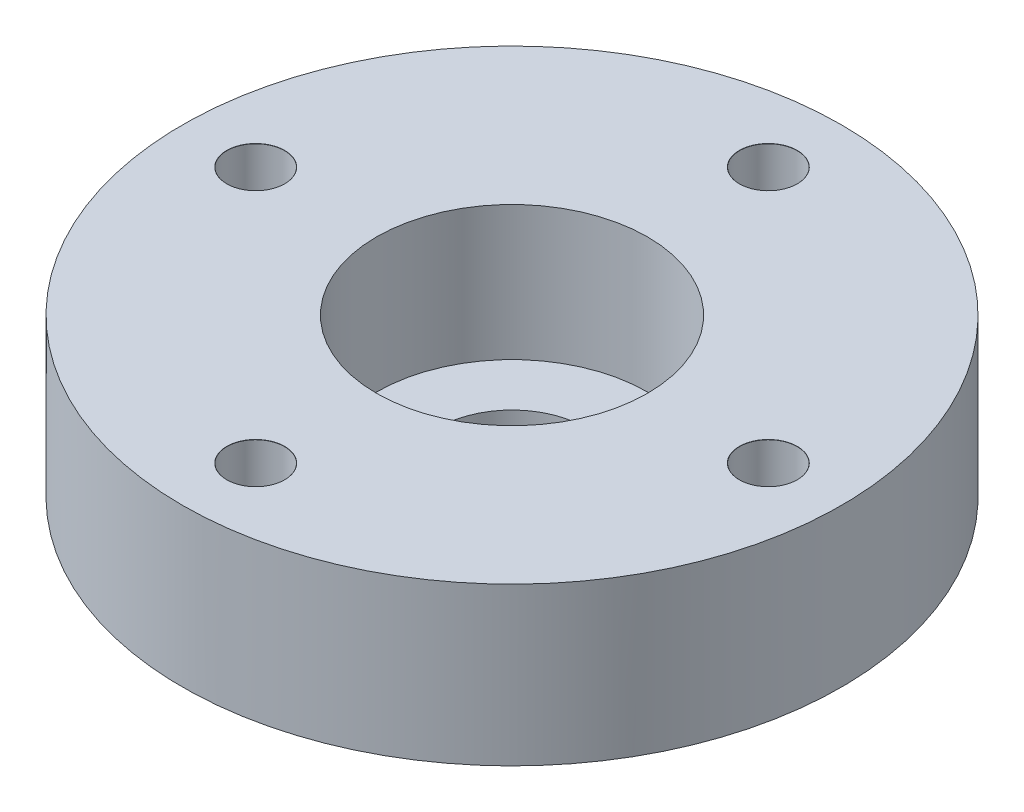
ISO-10303-21;
HEADER;
FILE_DESCRIPTION(('STEP AP214'),'2;1');
FILE_NAME('part.step','',(''),(''),'','','');
FILE_SCHEMA(('AUTOMOTIVE_DESIGN { 1 0 10303 214 1 1 1 1 }'));
ENDSEC;
DATA;
#1=APPLICATION_CONTEXT('core data for automotive mechanical design processes');
#2=APPLICATION_PROTOCOL_DEFINITION('international standard','automotive_design',2000,#1);
#3=PRODUCT_CONTEXT('',#1,'mechanical');
#4=PRODUCT('Part','Part','',(#3));
#5=PRODUCT_RELATED_PRODUCT_CATEGORY('part','',(#4));
#6=PRODUCT_DEFINITION_FORMATION('','',#4);
#7=PRODUCT_DEFINITION_CONTEXT('part definition',#1,'design');
#8=PRODUCT_DEFINITION('design','',#6,#7);
#9=PRODUCT_DEFINITION_SHAPE('','',#8);
#10=(LENGTH_UNIT() NAMED_UNIT(*) SI_UNIT(.MILLI.,.METRE.));
#11=(NAMED_UNIT(*) PLANE_ANGLE_UNIT() SI_UNIT($,.RADIAN.));
#12=(NAMED_UNIT(*) SI_UNIT($,.STERADIAN.) SOLID_ANGLE_UNIT());
#13=UNCERTAINTY_MEASURE_WITH_UNIT(LENGTH_MEASURE(1.E-05),#10,'distance_accuracy_value','');
#14=(GEOMETRIC_REPRESENTATION_CONTEXT(3) GLOBAL_UNCERTAINTY_ASSIGNED_CONTEXT((#13)) GLOBAL_UNIT_ASSIGNED_CONTEXT((#10,
#11,#12)) REPRESENTATION_CONTEXT('',''));
#15=CARTESIAN_POINT('',(0.,0.,0.));
#16=DIRECTION('',(0.,0.,1.));
#17=DIRECTION('',(1.,0.,0.));
#18=AXIS2_PLACEMENT_3D('',#15,#16,#17);
#19=CARTESIAN_POINT('',(0.,-7.,0.));
#20=DIRECTION('',(0.,-1.,0.));
#21=DIRECTION('',(0.,0.,-1.));
#22=AXIS2_PLACEMENT_3D('',#19,#20,#21);
#23=PLANE('',#22);
#24=CARTESIAN_POINT('',(-44.45,-7.,0.));
#25=DIRECTION('',(0.,1.,0.));
#26=DIRECTION('',(0.,0.,1.));
#27=AXIS2_PLACEMENT_3D('',#24,#25,#26);
#28=CIRCLE('',#27,5.025);
#29=CARTESIAN_POINT('',(-44.45,-7.,5.025));
#30=VERTEX_POINT('',#29);
#31=EDGE_CURVE('E112',#30,#30,#28,.T.);
#32=ORIENTED_EDGE('',*,*,#31,.T.);
#33=EDGE_LOOP('',(#32));
#34=FACE_BOUND('',#33,.T.);
#35=CARTESIAN_POINT('',(0.,-7.,44.45));
#36=DIRECTION('',(0.,1.,0.));
#37=DIRECTION('',(0.,0.,1.));
#38=AXIS2_PLACEMENT_3D('',#35,#36,#37);
#39=CIRCLE('',#38,5.02499999999999);
#40=CARTESIAN_POINT('',(0.,-7.,49.475));
#41=VERTEX_POINT('',#40);
#42=EDGE_CURVE('E100',#41,#41,#39,.T.);
#43=ORIENTED_EDGE('',*,*,#42,.T.);
#44=EDGE_LOOP('',(#43));
#45=FACE_BOUND('',#44,.T.);
#46=CARTESIAN_POINT('',(0.,-7.,-44.45));
#47=DIRECTION('',(0.,1.,0.));
#48=DIRECTION('',(0.,0.,1.));
#49=AXIS2_PLACEMENT_3D('',#46,#47,#48);
#50=CIRCLE('',#49,5.02499999999999);
#51=CARTESIAN_POINT('',(0.,-7.,-39.425));
#52=VERTEX_POINT('',#51);
#53=EDGE_CURVE('E88',#52,#52,#50,.T.);
#54=ORIENTED_EDGE('',*,*,#53,.T.);
#55=EDGE_LOOP('',(#54));
#56=FACE_BOUND('',#55,.T.);
#57=CARTESIAN_POINT('',(44.45,-7.,0.));
#58=DIRECTION('',(0.,1.,0.));
#59=DIRECTION('',(0.,0.,1.));
#60=AXIS2_PLACEMENT_3D('',#57,#58,#59);
#61=CIRCLE('',#60,5.025);
#62=CARTESIAN_POINT('',(44.45,-7.,5.025));
#63=VERTEX_POINT('',#62);
#64=EDGE_CURVE('E76',#63,#63,#61,.T.);
#65=ORIENTED_EDGE('',*,*,#64,.T.);
#66=EDGE_LOOP('',(#65));
#67=FACE_BOUND('',#66,.T.);
#68=CARTESIAN_POINT('',(0.,-7.,0.));
#69=DIRECTION('',(0.,-1.,0.));
#70=DIRECTION('',(0.,0.,-1.));
#71=AXIS2_PLACEMENT_3D('',#68,#69,#70);
#72=CIRCLE('',#71,57.15);
#73=CARTESIAN_POINT('',(0.,-7.,-57.15));
#74=VERTEX_POINT('',#73);
#75=EDGE_CURVE('E42',#74,#74,#72,.T.);
#76=ORIENTED_EDGE('',*,*,#75,.T.);
#77=EDGE_LOOP('',(#76));
#78=FACE_BOUND('',#77,.T.);
#79=CARTESIAN_POINT('',(0.,-7.,0.));
#80=DIRECTION('',(0.,-1.,0.));
#81=DIRECTION('',(0.,0.,-1.));
#82=AXIS2_PLACEMENT_3D('',#79,#80,#81);
#83=CIRCLE('',#82,15.);
#84=CARTESIAN_POINT('',(0.,-7.,-15.));
#85=VERTEX_POINT('',#84);
#86=EDGE_CURVE('E53',#85,#85,#83,.T.);
#87=ORIENTED_EDGE('',*,*,#86,.F.);
#88=EDGE_LOOP('',(#87));
#89=FACE_BOUND('',#88,.T.);
#90=ADVANCED_FACE('F35',(#34,#45,#56,#67,#78,#89),#23,.T.);
#91=CARTESIAN_POINT('',(0.,175.644610179245,0.));
#92=DIRECTION('',(0.,-1.,0.));
#93=DIRECTION('',(0.,0.,-1.));
#94=AXIS2_PLACEMENT_3D('',#91,#92,#93);
#95=CYLINDRICAL_SURFACE('',#94,57.15);
#96=ORIENTED_EDGE('',*,*,#75,.F.);
#97=EDGE_LOOP('',(#96));
#98=FACE_BOUND('',#97,.T.);
#99=CARTESIAN_POINT('',(0.,20.3,0.));
#100=DIRECTION('',(0.,1.,0.));
#101=DIRECTION('',(0.,0.,1.));
#102=AXIS2_PLACEMENT_3D('',#99,#100,#101);
#103=CIRCLE('',#102,57.15);
#104=CARTESIAN_POINT('',(0.,20.3,57.15));
#105=VERTEX_POINT('',#104);
#106=EDGE_CURVE('E61',#105,#105,#103,.T.);
#107=ORIENTED_EDGE('',*,*,#106,.F.);
#108=EDGE_LOOP('',(#107));
#109=FACE_BOUND('',#108,.T.);
#110=ADVANCED_FACE('F37',(#98,#109),#95,.T.);
#111=CARTESIAN_POINT('',(0.,80.4680374315355,0.));
#112=DIRECTION('',(0.,-1.,0.));
#113=DIRECTION('',(0.,0.,-1.));
#114=AXIS2_PLACEMENT_3D('',#111,#112,#113);
#115=CYLINDRICAL_SURFACE('',#114,23.5);
#116=CARTESIAN_POINT('',(0.,-3.,0.));
#117=DIRECTION('',(0.,-1.,0.));
#118=DIRECTION('',(0.,0.,-1.));
#119=AXIS2_PLACEMENT_3D('',#116,#117,#118);
#120=CIRCLE('',#119,23.5);
#121=CARTESIAN_POINT('',(0.,-3.,-23.5));
#122=VERTEX_POINT('',#121);
#123=EDGE_CURVE('E10',#122,#122,#120,.F.);
#124=ORIENTED_EDGE('',*,*,#123,.F.);
#125=EDGE_LOOP('',(#124));
#126=FACE_BOUND('',#125,.T.);
#127=CARTESIAN_POINT('',(0.,20.3,0.));
#128=DIRECTION('',(0.,1.,0.));
#129=DIRECTION('',(0.,0.,1.));
#130=AXIS2_PLACEMENT_3D('',#127,#128,#129);
#131=CIRCLE('',#130,23.5);
#132=CARTESIAN_POINT('',(0.,20.3,23.5));
#133=VERTEX_POINT('',#132);
#134=EDGE_CURVE('E64',#133,#133,#131,.T.);
#135=ORIENTED_EDGE('',*,*,#134,.T.);
#136=EDGE_LOOP('',(#135));
#137=FACE_BOUND('',#136,.T.);
#138=ADVANCED_FACE('F153',(#126,#137),#115,.F.);
#139=CARTESIAN_POINT('',(0.,-3.,0.));
#140=DIRECTION('',(0.,-1.,0.));
#141=DIRECTION('',(0.,0.,-1.));
#142=AXIS2_PLACEMENT_3D('',#139,#140,#141);
#143=PLANE('',#142);
#144=CARTESIAN_POINT('',(0.,-3.,0.));
#145=DIRECTION('',(0.,-1.,0.));
#146=DIRECTION('',(0.,0.,-1.));
#147=AXIS2_PLACEMENT_3D('',#144,#145,#146);
#148=CIRCLE('',#147,12.8);
#149=CARTESIAN_POINT('',(0.,-3.,-12.8));
#150=VERTEX_POINT('',#149);
#151=EDGE_CURVE('E46',#150,#150,#148,.T.);
#152=ORIENTED_EDGE('',*,*,#151,.T.);
#153=EDGE_LOOP('',(#152));
#154=FACE_BOUND('',#153,.T.);
#155=ORIENTED_EDGE('',*,*,#123,.T.);
#156=EDGE_LOOP('',(#155));
#157=FACE_BOUND('',#156,.T.);
#158=ADVANCED_FACE('F155',(#154,#157),#143,.F.);
#159=CARTESIAN_POINT('',(0.,-7.,0.));
#160=DIRECTION('',(0.,1.,0.));
#161=DIRECTION('',(0.,0.,1.));
#162=AXIS2_PLACEMENT_3D('',#159,#160,#161);
#163=CYLINDRICAL_SURFACE('',#162,12.8);
#164=ORIENTED_EDGE('',*,*,#151,.F.);
#165=EDGE_LOOP('',(#164));
#166=FACE_BOUND('',#165,.T.);
#167=CARTESIAN_POINT('',(0.,-9.,0.));
#168=DIRECTION('',(0.,-1.,0.));
#169=DIRECTION('',(0.,0.,-1.));
#170=AXIS2_PLACEMENT_3D('',#167,#168,#169);
#171=CIRCLE('',#170,12.8);
#172=CARTESIAN_POINT('',(0.,-9.,-12.8));
#173=VERTEX_POINT('',#172);
#174=EDGE_CURVE('E56',#173,#173,#171,.T.);
#175=ORIENTED_EDGE('',*,*,#174,.T.);
#176=EDGE_LOOP('',(#175));
#177=FACE_BOUND('',#176,.T.);
#178=ADVANCED_FACE('F161',(#166,#177),#163,.F.);
#179=CARTESIAN_POINT('',(0.,-9.,0.));
#180=DIRECTION('',(0.,-1.,0.));
#181=DIRECTION('',(0.,0.,-1.));
#182=AXIS2_PLACEMENT_3D('',#179,#180,#181);
#183=PLANE('',#182);
#184=CARTESIAN_POINT('',(0.,-9.,0.));
#185=DIRECTION('',(0.,-1.,0.));
#186=DIRECTION('',(0.,0.,-1.));
#187=AXIS2_PLACEMENT_3D('',#184,#185,#186);
#188=CIRCLE('',#187,15.);
#189=CARTESIAN_POINT('',(0.,-9.,-15.));
#190=VERTEX_POINT('',#189);
#191=EDGE_CURVE('E50',#190,#190,#188,.T.);
#192=ORIENTED_EDGE('',*,*,#191,.T.);
#193=EDGE_LOOP('',(#192));
#194=FACE_BOUND('',#193,.T.);
#195=ORIENTED_EDGE('',*,*,#174,.F.);
#196=EDGE_LOOP('',(#195));
#197=FACE_BOUND('',#196,.T.);
#198=ADVANCED_FACE('F172',(#194,#197),#183,.T.);
#199=CARTESIAN_POINT('',(0.,-9.,0.));
#200=DIRECTION('',(0.,1.,0.));
#201=DIRECTION('',(0.,0.,1.));
#202=AXIS2_PLACEMENT_3D('',#199,#200,#201);
#203=CYLINDRICAL_SURFACE('',#202,15.);
#204=ORIENTED_EDGE('',*,*,#191,.F.);
#205=EDGE_LOOP('',(#204));
#206=FACE_BOUND('',#205,.T.);
#207=ORIENTED_EDGE('',*,*,#86,.T.);
#208=EDGE_LOOP('',(#207));
#209=FACE_BOUND('',#208,.T.);
#210=ADVANCED_FACE('F141',(#206,#209),#203,.T.);
#211=CARTESIAN_POINT('',(0.,20.3,0.));
#212=DIRECTION('',(0.,1.,0.));
#213=DIRECTION('',(0.,0.,1.));
#214=AXIS2_PLACEMENT_3D('',#211,#212,#213);
#215=PLANE('',#214);
#216=CARTESIAN_POINT('',(-44.45,20.3,0.));
#217=DIRECTION('',(0.,1.,0.));
#218=DIRECTION('',(0.,0.,1.));
#219=AXIS2_PLACEMENT_3D('',#216,#217,#218);
#220=CIRCLE('',#219,5.025);
#221=CARTESIAN_POINT('',(-44.45,20.3,5.025));
#222=VERTEX_POINT('',#221);
#223=EDGE_CURVE('E109',#222,#222,#220,.T.);
#224=ORIENTED_EDGE('',*,*,#223,.F.);
#225=EDGE_LOOP('',(#224));
#226=FACE_BOUND('',#225,.T.);
#227=CARTESIAN_POINT('',(0.,20.3,44.45));
#228=DIRECTION('',(0.,1.,0.));
#229=DIRECTION('',(0.,0.,1.));
#230=AXIS2_PLACEMENT_3D('',#227,#228,#229);
#231=CIRCLE('',#230,5.025);
#232=CARTESIAN_POINT('',(0.,20.3,49.475));
#233=VERTEX_POINT('',#232);
#234=EDGE_CURVE('E97',#233,#233,#231,.T.);
#235=ORIENTED_EDGE('',*,*,#234,.F.);
#236=EDGE_LOOP('',(#235));
#237=FACE_BOUND('',#236,.T.);
#238=CARTESIAN_POINT('',(0.,20.3,-44.45));
#239=DIRECTION('',(0.,1.,0.));
#240=DIRECTION('',(0.,0.,1.));
#241=AXIS2_PLACEMENT_3D('',#238,#239,#240);
#242=CIRCLE('',#241,5.025);
#243=CARTESIAN_POINT('',(0.,20.3,-39.425));
#244=VERTEX_POINT('',#243);
#245=EDGE_CURVE('E85',#244,#244,#242,.T.);
#246=ORIENTED_EDGE('',*,*,#245,.F.);
#247=EDGE_LOOP('',(#246));
#248=FACE_BOUND('',#247,.T.);
#249=CARTESIAN_POINT('',(44.45,20.3,0.));
#250=DIRECTION('',(0.,1.,0.));
#251=DIRECTION('',(0.,0.,1.));
#252=AXIS2_PLACEMENT_3D('',#249,#250,#251);
#253=CIRCLE('',#252,5.025);
#254=CARTESIAN_POINT('',(44.45,20.3,5.025));
#255=VERTEX_POINT('',#254);
#256=EDGE_CURVE('E73',#255,#255,#253,.T.);
#257=ORIENTED_EDGE('',*,*,#256,.F.);
#258=EDGE_LOOP('',(#257));
#259=FACE_BOUND('',#258,.T.);
#260=ORIENTED_EDGE('',*,*,#106,.T.);
#261=EDGE_LOOP('',(#260));
#262=FACE_BOUND('',#261,.T.);
#263=ORIENTED_EDGE('',*,*,#134,.F.);
#264=EDGE_LOOP('',(#263));
#265=FACE_BOUND('',#264,.T.);
#266=ADVANCED_FACE('F137',(#226,#237,#248,#259,#262,#265),#215,.T.);
#267=CARTESIAN_POINT('',(44.45,-6.97499999999999,0.));
#268=DIRECTION('',(0.,-1.,0.));
#269=DIRECTION('',(0.,0.,-1.));
#270=AXIS2_PLACEMENT_3D('',#267,#268,#269);
#271=CONICAL_SURFACE('',#270,5.,0.785398163397309);
#272=ORIENTED_EDGE('',*,*,#64,.F.);
#273=EDGE_LOOP('',(#272));
#274=FACE_BOUND('',#273,.T.);
#275=CARTESIAN_POINT('',(44.45,-6.97499999999999,0.));
#276=DIRECTION('',(0.,1.,0.));
#277=DIRECTION('',(0.,0.,1.));
#278=AXIS2_PLACEMENT_3D('',#275,#276,#277);
#279=CIRCLE('',#278,5.);
#280=CARTESIAN_POINT('',(44.45,-6.97499999999999,5.));
#281=VERTEX_POINT('',#280);
#282=EDGE_CURVE('E67',#281,#281,#279,.T.);
#283=ORIENTED_EDGE('',*,*,#282,.T.);
#284=EDGE_LOOP('',(#283));
#285=FACE_BOUND('',#284,.T.);
#286=ADVANCED_FACE('F140',(#274,#285),#271,.F.);
#287=CARTESIAN_POINT('',(44.45,20.3,0.));
#288=DIRECTION('',(0.,1.,0.));
#289=DIRECTION('',(0.,0.,1.));
#290=AXIS2_PLACEMENT_3D('',#287,#288,#289);
#291=CYLINDRICAL_SURFACE('',#290,5.);
#292=ORIENTED_EDGE('',*,*,#282,.F.);
#293=EDGE_LOOP('',(#292));
#294=FACE_BOUND('',#293,.T.);
#295=CARTESIAN_POINT('',(44.45,20.275,0.));
#296=DIRECTION('',(0.,1.,0.));
#297=DIRECTION('',(0.,0.,1.));
#298=AXIS2_PLACEMENT_3D('',#295,#296,#297);
#299=CIRCLE('',#298,5.);
#300=CARTESIAN_POINT('',(44.45,20.275,5.));
#301=VERTEX_POINT('',#300);
#302=EDGE_CURVE('E70',#301,#301,#299,.T.);
#303=ORIENTED_EDGE('',*,*,#302,.T.);
#304=EDGE_LOOP('',(#303));
#305=FACE_BOUND('',#304,.T.);
#306=ADVANCED_FACE('F182',(#294,#305),#291,.F.);
#307=CARTESIAN_POINT('',(44.45,20.3,0.));
#308=DIRECTION('',(0.,1.,0.));
#309=DIRECTION('',(0.,0.,1.));
#310=AXIS2_PLACEMENT_3D('',#307,#308,#309);
#311=CONICAL_SURFACE('',#310,5.025,0.785398163397379);
#312=ORIENTED_EDGE('',*,*,#302,.F.);
#313=EDGE_LOOP('',(#312));
#314=FACE_BOUND('',#313,.T.);
#315=ORIENTED_EDGE('',*,*,#256,.T.);
#316=EDGE_LOOP('',(#315));
#317=FACE_BOUND('',#316,.T.);
#318=ADVANCED_FACE('F186',(#314,#317),#311,.F.);
#319=CARTESIAN_POINT('',(0.,-6.97499999999999,-44.45));
#320=DIRECTION('',(0.,-1.,0.));
#321=DIRECTION('',(0.,0.,-1.));
#322=AXIS2_PLACEMENT_3D('',#319,#320,#321);
#323=CONICAL_SURFACE('',#322,4.99999999999999,0.785398163397344);
#324=ORIENTED_EDGE('',*,*,#53,.F.);
#325=EDGE_LOOP('',(#324));
#326=FACE_BOUND('',#325,.T.);
#327=CARTESIAN_POINT('',(0.,-6.97499999999999,-44.45));
#328=DIRECTION('',(0.,1.,0.));
#329=DIRECTION('',(0.,0.,1.));
#330=AXIS2_PLACEMENT_3D('',#327,#328,#329);
#331=CIRCLE('',#330,4.99999999999999);
#332=CARTESIAN_POINT('',(0.,-6.97499999999999,-39.45));
#333=VERTEX_POINT('',#332);
#334=EDGE_CURVE('E79',#333,#333,#331,.T.);
#335=ORIENTED_EDGE('',*,*,#334,.T.);
#336=EDGE_LOOP('',(#335));
#337=FACE_BOUND('',#336,.T.);
#338=ADVANCED_FACE('F190',(#326,#337),#323,.F.);
#339=CARTESIAN_POINT('',(0.,20.3,-44.45));
#340=DIRECTION('',(0.,1.,0.));
#341=DIRECTION('',(0.,0.,1.));
#342=AXIS2_PLACEMENT_3D('',#339,#340,#341);
#343=CYLINDRICAL_SURFACE('',#342,5.);
#344=ORIENTED_EDGE('',*,*,#334,.F.);
#345=EDGE_LOOP('',(#344));
#346=FACE_BOUND('',#345,.T.);
#347=CARTESIAN_POINT('',(0.,20.275,-44.45));
#348=DIRECTION('',(0.,1.,0.));
#349=DIRECTION('',(0.,0.,1.));
#350=AXIS2_PLACEMENT_3D('',#347,#348,#349);
#351=CIRCLE('',#350,5.);
#352=CARTESIAN_POINT('',(0.,20.275,-39.45));
#353=VERTEX_POINT('',#352);
#354=EDGE_CURVE('E82',#353,#353,#351,.T.);
#355=ORIENTED_EDGE('',*,*,#354,.T.);
#356=EDGE_LOOP('',(#355));
#357=FACE_BOUND('',#356,.T.);
#358=ADVANCED_FACE('F194',(#346,#357),#343,.F.);
#359=CARTESIAN_POINT('',(0.,20.3,-44.45));
#360=DIRECTION('',(0.,1.,0.));
#361=DIRECTION('',(0.,0.,1.));
#362=AXIS2_PLACEMENT_3D('',#359,#360,#361);
#363=CONICAL_SURFACE('',#362,5.025,0.785398163397362);
#364=ORIENTED_EDGE('',*,*,#354,.F.);
#365=EDGE_LOOP('',(#364));
#366=FACE_BOUND('',#365,.T.);
#367=ORIENTED_EDGE('',*,*,#245,.T.);
#368=EDGE_LOOP('',(#367));
#369=FACE_BOUND('',#368,.T.);
#370=ADVANCED_FACE('F198',(#366,#369),#363,.F.);
#371=CARTESIAN_POINT('',(0.,-6.97499999999999,44.45));
#372=DIRECTION('',(0.,-1.,0.));
#373=DIRECTION('',(0.,0.,-1.));
#374=AXIS2_PLACEMENT_3D('',#371,#372,#373);
#375=CONICAL_SURFACE('',#374,4.99999999999999,0.785398163397344);
#376=ORIENTED_EDGE('',*,*,#42,.F.);
#377=EDGE_LOOP('',(#376));
#378=FACE_BOUND('',#377,.T.);
#379=CARTESIAN_POINT('',(0.,-6.97499999999999,44.45));
#380=DIRECTION('',(0.,1.,0.));
#381=DIRECTION('',(0.,0.,1.));
#382=AXIS2_PLACEMENT_3D('',#379,#380,#381);
#383=CIRCLE('',#382,4.99999999999999);
#384=CARTESIAN_POINT('',(0.,-6.97499999999999,49.45));
#385=VERTEX_POINT('',#384);
#386=EDGE_CURVE('E91',#385,#385,#383,.T.);
#387=ORIENTED_EDGE('',*,*,#386,.T.);
#388=EDGE_LOOP('',(#387));
#389=FACE_BOUND('',#388,.T.);
#390=ADVANCED_FACE('F202',(#378,#389),#375,.F.);
#391=CARTESIAN_POINT('',(0.,20.3,44.45));
#392=DIRECTION('',(0.,1.,0.));
#393=DIRECTION('',(0.,0.,1.));
#394=AXIS2_PLACEMENT_3D('',#391,#392,#393);
#395=CYLINDRICAL_SURFACE('',#394,5.);
#396=ORIENTED_EDGE('',*,*,#386,.F.);
#397=EDGE_LOOP('',(#396));
#398=FACE_BOUND('',#397,.T.);
#399=CARTESIAN_POINT('',(0.,20.275,44.45));
#400=DIRECTION('',(0.,1.,0.));
#401=DIRECTION('',(0.,0.,1.));
#402=AXIS2_PLACEMENT_3D('',#399,#400,#401);
#403=CIRCLE('',#402,5.);
#404=CARTESIAN_POINT('',(0.,20.275,49.45));
#405=VERTEX_POINT('',#404);
#406=EDGE_CURVE('E94',#405,#405,#403,.T.);
#407=ORIENTED_EDGE('',*,*,#406,.T.);
#408=EDGE_LOOP('',(#407));
#409=FACE_BOUND('',#408,.T.);
#410=ADVANCED_FACE('F206',(#398,#409),#395,.F.);
#411=CARTESIAN_POINT('',(0.,20.3,44.45));
#412=DIRECTION('',(0.,1.,0.));
#413=DIRECTION('',(0.,0.,1.));
#414=AXIS2_PLACEMENT_3D('',#411,#412,#413);
#415=CONICAL_SURFACE('',#414,5.025,0.785398163397362);
#416=ORIENTED_EDGE('',*,*,#406,.F.);
#417=EDGE_LOOP('',(#416));
#418=FACE_BOUND('',#417,.T.);
#419=ORIENTED_EDGE('',*,*,#234,.T.);
#420=EDGE_LOOP('',(#419));
#421=FACE_BOUND('',#420,.T.);
#422=ADVANCED_FACE('F122',(#418,#421),#415,.F.);
#423=CARTESIAN_POINT('',(-44.45,-6.97499999999999,0.));
#424=DIRECTION('',(0.,-1.,0.));
#425=DIRECTION('',(0.,0.,-1.));
#426=AXIS2_PLACEMENT_3D('',#423,#424,#425);
#427=CONICAL_SURFACE('',#426,5.,0.785398163397309);
#428=ORIENTED_EDGE('',*,*,#31,.F.);
#429=EDGE_LOOP('',(#428));
#430=FACE_BOUND('',#429,.T.);
#431=CARTESIAN_POINT('',(-44.45,-6.97499999999999,0.));
#432=DIRECTION('',(0.,1.,0.));
#433=DIRECTION('',(0.,0.,1.));
#434=AXIS2_PLACEMENT_3D('',#431,#432,#433);
#435=CIRCLE('',#434,5.);
#436=CARTESIAN_POINT('',(-44.45,-6.97499999999999,5.));
#437=VERTEX_POINT('',#436);
#438=EDGE_CURVE('E103',#437,#437,#435,.T.);
#439=ORIENTED_EDGE('',*,*,#438,.T.);
#440=EDGE_LOOP('',(#439));
#441=FACE_BOUND('',#440,.T.);
#442=ADVANCED_FACE('F118',(#430,#441),#427,.F.);
#443=CARTESIAN_POINT('',(-44.45,20.3,0.));
#444=DIRECTION('',(0.,1.,0.));
#445=DIRECTION('',(0.,0.,1.));
#446=AXIS2_PLACEMENT_3D('',#443,#444,#445);
#447=CYLINDRICAL_SURFACE('',#446,5.);
#448=ORIENTED_EDGE('',*,*,#438,.F.);
#449=EDGE_LOOP('',(#448));
#450=FACE_BOUND('',#449,.T.);
#451=CARTESIAN_POINT('',(-44.45,20.275,0.));
#452=DIRECTION('',(0.,1.,0.));
#453=DIRECTION('',(0.,0.,1.));
#454=AXIS2_PLACEMENT_3D('',#451,#452,#453);
#455=CIRCLE('',#454,5.);
#456=CARTESIAN_POINT('',(-44.45,20.275,5.));
#457=VERTEX_POINT('',#456);
#458=EDGE_CURVE('E106',#457,#457,#455,.T.);
#459=ORIENTED_EDGE('',*,*,#458,.T.);
#460=EDGE_LOOP('',(#459));
#461=FACE_BOUND('',#460,.T.);
#462=ADVANCED_FACE('F121',(#450,#461),#447,.F.);
#463=CARTESIAN_POINT('',(-44.45,20.3,0.));
#464=DIRECTION('',(0.,1.,0.));
#465=DIRECTION('',(0.,0.,1.));
#466=AXIS2_PLACEMENT_3D('',#463,#464,#465);
#467=CONICAL_SURFACE('',#466,5.025,0.785398163397379);
#468=ORIENTED_EDGE('',*,*,#458,.F.);
#469=EDGE_LOOP('',(#468));
#470=FACE_BOUND('',#469,.T.);
#471=ORIENTED_EDGE('',*,*,#223,.T.);
#472=EDGE_LOOP('',(#471));
#473=FACE_BOUND('',#472,.T.);
#474=ADVANCED_FACE('F128',(#470,#473),#467,.F.);
#475=CLOSED_SHELL('',(#90,#110,#138,#158,#178,#198,#210,#266,#286,#306,#318,#338,#358,#370,#390,
#410,#422,#442,#462,#474));
#476=MANIFOLD_SOLID_BREP('B2',#475);
#477=ADVANCED_BREP_SHAPE_REPRESENTATION('',(#18,#476),#14);
#478=SHAPE_DEFINITION_REPRESENTATION(#9,#477);
ENDSEC;
END-ISO-10303-21;
